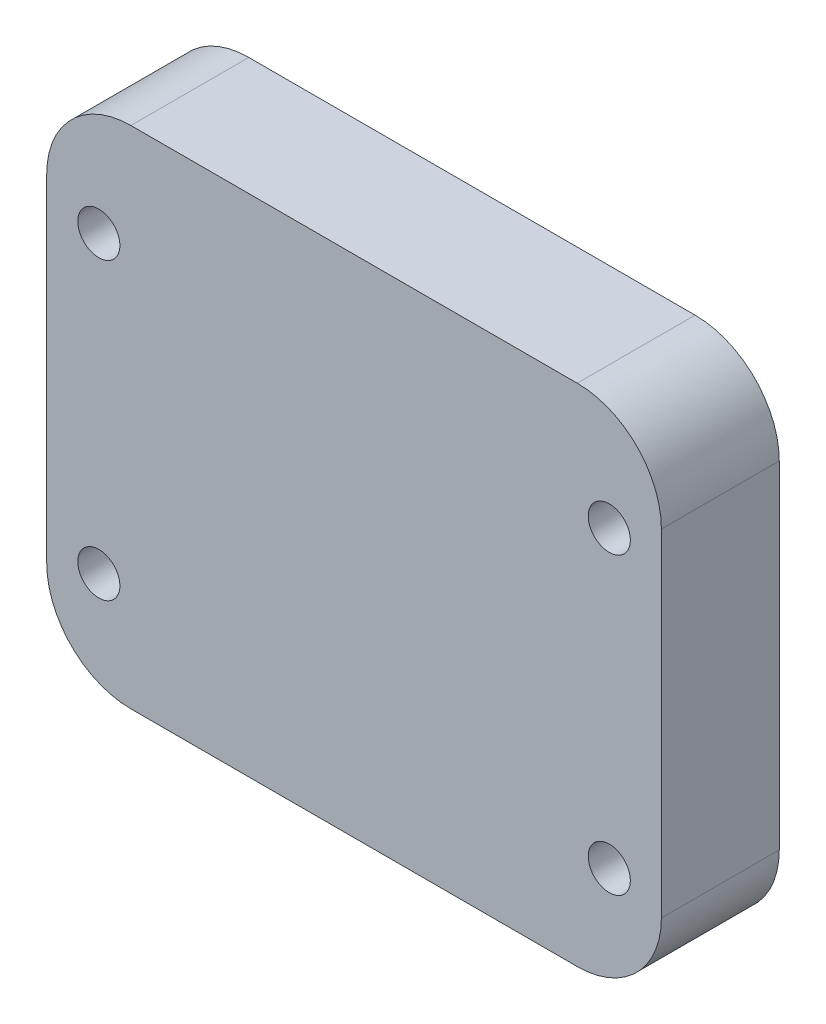
ISO-10303-21;
HEADER;
FILE_DESCRIPTION(('STEP AP214'),'2;1');
FILE_NAME('part.step','',(''),(''),'','','');
FILE_SCHEMA(('AUTOMOTIVE_DESIGN { 1 0 10303 214 1 1 1 1 }'));
ENDSEC;
DATA;
#1=APPLICATION_CONTEXT('core data for automotive mechanical design processes');
#2=APPLICATION_PROTOCOL_DEFINITION('international standard','automotive_design',2000,#1);
#3=PRODUCT_CONTEXT('',#1,'mechanical');
#4=PRODUCT('Part','Part','',(#3));
#5=PRODUCT_RELATED_PRODUCT_CATEGORY('part','',(#4));
#6=PRODUCT_DEFINITION_FORMATION('','',#4);
#7=PRODUCT_DEFINITION_CONTEXT('part definition',#1,'design');
#8=PRODUCT_DEFINITION('design','',#6,#7);
#9=PRODUCT_DEFINITION_SHAPE('','',#8);
#10=(LENGTH_UNIT() NAMED_UNIT(*) SI_UNIT(.MILLI.,.METRE.));
#11=(NAMED_UNIT(*) PLANE_ANGLE_UNIT() SI_UNIT($,.RADIAN.));
#12=(NAMED_UNIT(*) SI_UNIT($,.STERADIAN.) SOLID_ANGLE_UNIT());
#13=UNCERTAINTY_MEASURE_WITH_UNIT(LENGTH_MEASURE(1.E-05),#10,'distance_accuracy_value','');
#14=(GEOMETRIC_REPRESENTATION_CONTEXT(3) GLOBAL_UNCERTAINTY_ASSIGNED_CONTEXT((#13)) GLOBAL_UNIT_ASSIGNED_CONTEXT((#10,
#11,#12)) REPRESENTATION_CONTEXT('',''));
#15=CARTESIAN_POINT('',(0.,0.,0.));
#16=DIRECTION('',(0.,0.,1.));
#17=DIRECTION('',(1.,0.,0.));
#18=AXIS2_PLACEMENT_3D('',#15,#16,#17);
#19=CARTESIAN_POINT('',(-26.5,-20.,14.));
#20=DIRECTION('',(0.,0.,1.));
#21=DIRECTION('',(1.,0.,0.));
#22=AXIS2_PLACEMENT_3D('',#19,#20,#21);
#23=CYLINDRICAL_SURFACE('',#22,10.);
#24=DIRECTION('',(0.,0.,1.));
#25=VECTOR('',#24,1.);
#26=CARTESIAN_POINT('',(-36.5,-20.,14.));
#27=LINE('',#26,#25);
#28=CARTESIAN_POINT('',(-36.5,-20.,0.));
#29=VERTEX_POINT('',#28);
#30=CARTESIAN_POINT('',(-36.5,-20.,14.));
#31=VERTEX_POINT('',#30);
#32=EDGE_CURVE('E148',#29,#31,#27,.T.);
#33=ORIENTED_EDGE('',*,*,#32,.F.);
#34=CARTESIAN_POINT('',(-26.5,-20.,0.));
#35=DIRECTION('',(0.,0.,1.));
#36=DIRECTION('',(1.,0.,0.));
#37=AXIS2_PLACEMENT_3D('',#34,#35,#36);
#38=CIRCLE('',#37,10.);
#39=CARTESIAN_POINT('',(-26.5,-30.,0.));
#40=VERTEX_POINT('',#39);
#41=EDGE_CURVE('E40',#40,#29,#38,.F.);
#42=ORIENTED_EDGE('',*,*,#41,.F.);
#43=DIRECTION('',(0.,0.,1.));
#44=VECTOR('',#43,1.);
#45=CARTESIAN_POINT('',(-26.5,-30.,14.));
#46=LINE('',#45,#44);
#47=CARTESIAN_POINT('',(-26.5,-30.,14.));
#48=VERTEX_POINT('',#47);
#49=EDGE_CURVE('E100',#48,#40,#46,.F.);
#50=ORIENTED_EDGE('',*,*,#49,.F.);
#51=CARTESIAN_POINT('',(-26.5,-20.,14.));
#52=DIRECTION('',(0.,0.,1.));
#53=DIRECTION('',(1.,0.,0.));
#54=AXIS2_PLACEMENT_3D('',#51,#52,#53);
#55=CIRCLE('',#54,10.);
#56=EDGE_CURVE('E11',#31,#48,#55,.T.);
#57=ORIENTED_EDGE('',*,*,#56,.F.);
#58=EDGE_LOOP('',(#33,#42,#50,#57));
#59=FACE_BOUND('',#58,.T.);
#60=ADVANCED_FACE('F33',(#59),#23,.T.);
#61=CARTESIAN_POINT('',(-26.5,20.,14.));
#62=DIRECTION('',(0.,0.,1.));
#63=DIRECTION('',(1.,0.,0.));
#64=AXIS2_PLACEMENT_3D('',#61,#62,#63);
#65=CYLINDRICAL_SURFACE('',#64,10.);
#66=DIRECTION('',(0.,0.,1.));
#67=VECTOR('',#66,1.);
#68=CARTESIAN_POINT('',(-26.5,30.,14.));
#69=LINE('',#68,#67);
#70=CARTESIAN_POINT('',(-26.5,30.,0.));
#71=VERTEX_POINT('',#70);
#72=CARTESIAN_POINT('',(-26.5,30.,14.));
#73=VERTEX_POINT('',#72);
#74=EDGE_CURVE('E138',#71,#73,#69,.T.);
#75=ORIENTED_EDGE('',*,*,#74,.F.);
#76=CARTESIAN_POINT('',(-26.5,20.,0.));
#77=DIRECTION('',(0.,0.,1.));
#78=DIRECTION('',(1.,0.,0.));
#79=AXIS2_PLACEMENT_3D('',#76,#77,#78);
#80=CIRCLE('',#79,10.);
#81=CARTESIAN_POINT('',(-36.5,20.,0.));
#82=VERTEX_POINT('',#81);
#83=EDGE_CURVE('E144',#82,#71,#80,.F.);
#84=ORIENTED_EDGE('',*,*,#83,.F.);
#85=DIRECTION('',(0.,0.,1.));
#86=VECTOR('',#85,1.);
#87=CARTESIAN_POINT('',(-36.5,20.,14.));
#88=LINE('',#87,#86);
#89=CARTESIAN_POINT('',(-36.5,20.,14.));
#90=VERTEX_POINT('',#89);
#91=EDGE_CURVE('E141',#90,#82,#88,.F.);
#92=ORIENTED_EDGE('',*,*,#91,.F.);
#93=CARTESIAN_POINT('',(-26.5,20.,14.));
#94=DIRECTION('',(0.,0.,1.));
#95=DIRECTION('',(1.,0.,0.));
#96=AXIS2_PLACEMENT_3D('',#93,#94,#95);
#97=CIRCLE('',#96,10.);
#98=EDGE_CURVE('E146',#73,#90,#97,.T.);
#99=ORIENTED_EDGE('',*,*,#98,.F.);
#100=EDGE_LOOP('',(#75,#84,#92,#99));
#101=FACE_BOUND('',#100,.T.);
#102=ADVANCED_FACE('F206',(#101),#65,.T.);
#103=CARTESIAN_POINT('',(26.5,20.,14.));
#104=DIRECTION('',(0.,0.,1.));
#105=DIRECTION('',(1.,0.,0.));
#106=AXIS2_PLACEMENT_3D('',#103,#104,#105);
#107=CYLINDRICAL_SURFACE('',#106,10.);
#108=DIRECTION('',(0.,0.,1.));
#109=VECTOR('',#108,1.);
#110=CARTESIAN_POINT('',(36.5,20.,14.));
#111=LINE('',#110,#109);
#112=CARTESIAN_POINT('',(36.5,20.,0.));
#113=VERTEX_POINT('',#112);
#114=CARTESIAN_POINT('',(36.5,20.,14.));
#115=VERTEX_POINT('',#114);
#116=EDGE_CURVE('E128',#113,#115,#111,.T.);
#117=ORIENTED_EDGE('',*,*,#116,.F.);
#118=CARTESIAN_POINT('',(26.5,20.,0.));
#119=DIRECTION('',(0.,0.,1.));
#120=DIRECTION('',(1.,0.,0.));
#121=AXIS2_PLACEMENT_3D('',#118,#119,#120);
#122=CIRCLE('',#121,10.);
#123=CARTESIAN_POINT('',(26.5,30.,0.));
#124=VERTEX_POINT('',#123);
#125=EDGE_CURVE('E134',#124,#113,#122,.F.);
#126=ORIENTED_EDGE('',*,*,#125,.F.);
#127=DIRECTION('',(0.,0.,1.));
#128=VECTOR('',#127,1.);
#129=CARTESIAN_POINT('',(26.5,30.,14.));
#130=LINE('',#129,#128);
#131=CARTESIAN_POINT('',(26.5,30.,14.));
#132=VERTEX_POINT('',#131);
#133=EDGE_CURVE('E131',#132,#124,#130,.F.);
#134=ORIENTED_EDGE('',*,*,#133,.F.);
#135=CARTESIAN_POINT('',(26.5,20.,14.));
#136=DIRECTION('',(0.,0.,1.));
#137=DIRECTION('',(1.,0.,0.));
#138=AXIS2_PLACEMENT_3D('',#135,#136,#137);
#139=CIRCLE('',#138,10.);
#140=EDGE_CURVE('E136',#115,#132,#139,.T.);
#141=ORIENTED_EDGE('',*,*,#140,.F.);
#142=EDGE_LOOP('',(#117,#126,#134,#141));
#143=FACE_BOUND('',#142,.T.);
#144=ADVANCED_FACE('F199',(#143),#107,.T.);
#145=CARTESIAN_POINT('',(26.5,-20.,14.));
#146=DIRECTION('',(0.,0.,1.));
#147=DIRECTION('',(1.,0.,0.));
#148=AXIS2_PLACEMENT_3D('',#145,#146,#147);
#149=CYLINDRICAL_SURFACE('',#148,10.);
#150=DIRECTION('',(0.,0.,1.));
#151=VECTOR('',#150,1.);
#152=CARTESIAN_POINT('',(26.5,-30.,14.));
#153=LINE('',#152,#151);
#154=CARTESIAN_POINT('',(26.5,-30.,0.));
#155=VERTEX_POINT('',#154);
#156=CARTESIAN_POINT('',(26.5,-30.,14.));
#157=VERTEX_POINT('',#156);
#158=EDGE_CURVE('E99',#155,#157,#153,.T.);
#159=ORIENTED_EDGE('',*,*,#158,.F.);
#160=CARTESIAN_POINT('',(26.5,-20.,0.));
#161=DIRECTION('',(0.,0.,1.));
#162=DIRECTION('',(1.,0.,0.));
#163=AXIS2_PLACEMENT_3D('',#160,#161,#162);
#164=CIRCLE('',#163,10.);
#165=CARTESIAN_POINT('',(36.5,-20.,0.));
#166=VERTEX_POINT('',#165);
#167=EDGE_CURVE('E106',#166,#155,#164,.F.);
#168=ORIENTED_EDGE('',*,*,#167,.F.);
#169=DIRECTION('',(0.,0.,1.));
#170=VECTOR('',#169,1.);
#171=CARTESIAN_POINT('',(36.5,-20.,14.));
#172=LINE('',#171,#170);
#173=CARTESIAN_POINT('',(36.5,-20.,14.));
#174=VERTEX_POINT('',#173);
#175=EDGE_CURVE('E113',#174,#166,#172,.F.);
#176=ORIENTED_EDGE('',*,*,#175,.F.);
#177=CARTESIAN_POINT('',(26.5,-20.,14.));
#178=DIRECTION('',(0.,0.,1.));
#179=DIRECTION('',(1.,0.,0.));
#180=AXIS2_PLACEMENT_3D('',#177,#178,#179);
#181=CIRCLE('',#180,10.);
#182=EDGE_CURVE('E112',#157,#174,#181,.T.);
#183=ORIENTED_EDGE('',*,*,#182,.F.);
#184=EDGE_LOOP('',(#159,#168,#176,#183));
#185=FACE_BOUND('',#184,.T.);
#186=ADVANCED_FACE('F116',(#185),#149,.T.);
#187=CARTESIAN_POINT('',(-36.5,-30.,14.));
#188=DIRECTION('',(1.,0.,0.));
#189=DIRECTION('',(0.,0.,-1.));
#190=AXIS2_PLACEMENT_3D('',#187,#188,#189);
#191=PLANE('',#190);
#192=DIRECTION('',(0.,-1.,0.));
#193=VECTOR('',#192,1.);
#194=CARTESIAN_POINT('',(-36.5,-30.,0.));
#195=LINE('',#194,#193);
#196=EDGE_CURVE('E103',#82,#29,#195,.T.);
#197=ORIENTED_EDGE('',*,*,#196,.T.);
#198=ORIENTED_EDGE('',*,*,#32,.T.);
#199=DIRECTION('',(0.,-1.,0.));
#200=VECTOR('',#199,1.);
#201=CARTESIAN_POINT('',(-36.5,-30.,14.));
#202=LINE('',#201,#200);
#203=EDGE_CURVE('E167',#90,#31,#202,.T.);
#204=ORIENTED_EDGE('',*,*,#203,.F.);
#205=ORIENTED_EDGE('',*,*,#91,.T.);
#206=EDGE_LOOP('',(#197,#198,#204,#205));
#207=FACE_BOUND('',#206,.T.);
#208=ADVANCED_FACE('F155',(#207),#191,.F.);
#209=CARTESIAN_POINT('',(36.5,-30.,14.));
#210=DIRECTION('',(0.,1.,0.));
#211=DIRECTION('',(-1.,0.,0.));
#212=AXIS2_PLACEMENT_3D('',#209,#210,#211);
#213=PLANE('',#212);
#214=DIRECTION('',(1.,0.,0.));
#215=VECTOR('',#214,1.);
#216=CARTESIAN_POINT('',(36.5,-30.,14.));
#217=LINE('',#216,#215);
#218=EDGE_CURVE('E190',#48,#157,#217,.T.);
#219=ORIENTED_EDGE('',*,*,#218,.F.);
#220=ORIENTED_EDGE('',*,*,#49,.T.);
#221=DIRECTION('',(1.,0.,0.));
#222=VECTOR('',#221,1.);
#223=CARTESIAN_POINT('',(36.5,-30.,0.));
#224=LINE('',#223,#222);
#225=EDGE_CURVE('E94',#40,#155,#224,.T.);
#226=ORIENTED_EDGE('',*,*,#225,.T.);
#227=ORIENTED_EDGE('',*,*,#158,.T.);
#228=EDGE_LOOP('',(#219,#220,#226,#227));
#229=FACE_BOUND('',#228,.T.);
#230=ADVANCED_FACE('F97',(#229),#213,.F.);
#231=CARTESIAN_POINT('',(36.5,-30.,14.));
#232=DIRECTION('',(-1.,0.,0.));
#233=DIRECTION('',(0.,0.,1.));
#234=AXIS2_PLACEMENT_3D('',#231,#232,#233);
#235=PLANE('',#234);
#236=DIRECTION('',(0.,1.,0.));
#237=VECTOR('',#236,1.);
#238=CARTESIAN_POINT('',(36.5,-30.,0.));
#239=LINE('',#238,#237);
#240=EDGE_CURVE('E102',#166,#113,#239,.T.);
#241=ORIENTED_EDGE('',*,*,#240,.T.);
#242=ORIENTED_EDGE('',*,*,#116,.T.);
#243=DIRECTION('',(0.,1.,0.));
#244=VECTOR('',#243,1.);
#245=CARTESIAN_POINT('',(36.5,-30.,14.));
#246=LINE('',#245,#244);
#247=EDGE_CURVE('E121',#174,#115,#246,.T.);
#248=ORIENTED_EDGE('',*,*,#247,.F.);
#249=ORIENTED_EDGE('',*,*,#175,.T.);
#250=EDGE_LOOP('',(#241,#242,#248,#249));
#251=FACE_BOUND('',#250,.T.);
#252=ADVANCED_FACE('F196',(#251),#235,.F.);
#253=CARTESIAN_POINT('',(36.5,30.,14.));
#254=DIRECTION('',(0.,-1.,0.));
#255=DIRECTION('',(1.,0.,0.));
#256=AXIS2_PLACEMENT_3D('',#253,#254,#255);
#257=PLANE('',#256);
#258=DIRECTION('',(-1.,0.,0.));
#259=VECTOR('',#258,1.);
#260=CARTESIAN_POINT('',(36.5,30.,0.));
#261=LINE('',#260,#259);
#262=EDGE_CURVE('E165',#124,#71,#261,.T.);
#263=ORIENTED_EDGE('',*,*,#262,.T.);
#264=ORIENTED_EDGE('',*,*,#74,.T.);
#265=DIRECTION('',(-1.,0.,0.));
#266=VECTOR('',#265,1.);
#267=CARTESIAN_POINT('',(36.5,30.,14.));
#268=LINE('',#267,#266);
#269=EDGE_CURVE('E117',#132,#73,#268,.T.);
#270=ORIENTED_EDGE('',*,*,#269,.F.);
#271=ORIENTED_EDGE('',*,*,#133,.T.);
#272=EDGE_LOOP('',(#263,#264,#270,#271));
#273=FACE_BOUND('',#272,.T.);
#274=ADVANCED_FACE('F203',(#273),#257,.F.);
#275=CARTESIAN_POINT('',(0.,0.,14.));
#276=DIRECTION('',(0.,0.,1.));
#277=DIRECTION('',(1.,0.,0.));
#278=AXIS2_PLACEMENT_3D('',#275,#276,#277);
#279=PLANE('',#278);
#280=CARTESIAN_POINT('',(-30.310889135,-18.,14.));
#281=DIRECTION('',(0.,0.,1.));
#282=DIRECTION('',(1.,0.,0.));
#283=AXIS2_PLACEMENT_3D('',#280,#281,#282);
#284=CIRCLE('',#283,2.5);
#285=CARTESIAN_POINT('',(-27.810889135,-18.,14.));
#286=VERTEX_POINT('',#285);
#287=EDGE_CURVE('E184',#286,#286,#284,.T.);
#288=ORIENTED_EDGE('',*,*,#287,.F.);
#289=EDGE_LOOP('',(#288));
#290=FACE_BOUND('',#289,.T.);
#291=CARTESIAN_POINT('',(30.310889135,-18.,14.));
#292=DIRECTION('',(0.,0.,1.));
#293=DIRECTION('',(1.,0.,0.));
#294=AXIS2_PLACEMENT_3D('',#291,#292,#293);
#295=CIRCLE('',#294,2.50000000000001);
#296=CARTESIAN_POINT('',(32.810889135,-18.,14.));
#297=VERTEX_POINT('',#296);
#298=EDGE_CURVE('E174',#297,#297,#295,.T.);
#299=ORIENTED_EDGE('',*,*,#298,.F.);
#300=EDGE_LOOP('',(#299));
#301=FACE_BOUND('',#300,.T.);
#302=CARTESIAN_POINT('',(30.310889135,17.,14.));
#303=DIRECTION('',(0.,0.,1.));
#304=DIRECTION('',(1.,0.,0.));
#305=AXIS2_PLACEMENT_3D('',#302,#303,#304);
#306=CIRCLE('',#305,2.50000000000001);
#307=CARTESIAN_POINT('',(32.810889135,17.,14.));
#308=VERTEX_POINT('',#307);
#309=EDGE_CURVE('E171',#308,#308,#306,.T.);
#310=ORIENTED_EDGE('',*,*,#309,.F.);
#311=EDGE_LOOP('',(#310));
#312=FACE_BOUND('',#311,.T.);
#313=CARTESIAN_POINT('',(-30.310889135,17.,14.));
#314=DIRECTION('',(0.,0.,1.));
#315=DIRECTION('',(1.,0.,0.));
#316=AXIS2_PLACEMENT_3D('',#313,#314,#315);
#317=CIRCLE('',#316,2.5);
#318=CARTESIAN_POINT('',(-27.810889135,17.,14.));
#319=VERTEX_POINT('',#318);
#320=EDGE_CURVE('E160',#319,#319,#317,.T.);
#321=ORIENTED_EDGE('',*,*,#320,.F.);
#322=EDGE_LOOP('',(#321));
#323=FACE_BOUND('',#322,.T.);
#324=ORIENTED_EDGE('',*,*,#203,.T.);
#325=ORIENTED_EDGE('',*,*,#56,.T.);
#326=ORIENTED_EDGE('',*,*,#218,.T.);
#327=ORIENTED_EDGE('',*,*,#182,.T.);
#328=ORIENTED_EDGE('',*,*,#247,.T.);
#329=ORIENTED_EDGE('',*,*,#140,.T.);
#330=ORIENTED_EDGE('',*,*,#269,.T.);
#331=ORIENTED_EDGE('',*,*,#98,.T.);
#332=EDGE_LOOP('',(#324,#325,#326,#327,#328,#329,#330,#331));
#333=FACE_BOUND('',#332,.T.);
#334=ADVANCED_FACE('F193',(#290,#301,#312,#323,#333),#279,.T.);
#335=CARTESIAN_POINT('',(0.,0.,0.));
#336=DIRECTION('',(0.,0.,1.));
#337=DIRECTION('',(1.,0.,0.));
#338=AXIS2_PLACEMENT_3D('',#335,#336,#337);
#339=PLANE('',#338);
#340=CARTESIAN_POINT('',(-30.310889135,-18.,0.));
#341=DIRECTION('',(0.,0.,1.));
#342=DIRECTION('',(1.,0.,0.));
#343=AXIS2_PLACEMENT_3D('',#340,#341,#342);
#344=CIRCLE('',#343,2.5);
#345=CARTESIAN_POINT('',(-27.810889135,-18.,0.));
#346=VERTEX_POINT('',#345);
#347=EDGE_CURVE('E124',#346,#346,#344,.T.);
#348=ORIENTED_EDGE('',*,*,#347,.T.);
#349=EDGE_LOOP('',(#348));
#350=FACE_BOUND('',#349,.T.);
#351=CARTESIAN_POINT('',(30.310889135,-18.,0.));
#352=DIRECTION('',(0.,0.,1.));
#353=DIRECTION('',(1.,0.,0.));
#354=AXIS2_PLACEMENT_3D('',#351,#352,#353);
#355=CIRCLE('',#354,2.50000000000001);
#356=CARTESIAN_POINT('',(32.810889135,-18.,0.));
#357=VERTEX_POINT('',#356);
#358=EDGE_CURVE('E172',#357,#357,#355,.T.);
#359=ORIENTED_EDGE('',*,*,#358,.T.);
#360=EDGE_LOOP('',(#359));
#361=FACE_BOUND('',#360,.T.);
#362=CARTESIAN_POINT('',(30.310889135,17.,0.));
#363=DIRECTION('',(0.,0.,1.));
#364=DIRECTION('',(1.,0.,0.));
#365=AXIS2_PLACEMENT_3D('',#362,#363,#364);
#366=CIRCLE('',#365,2.50000000000001);
#367=CARTESIAN_POINT('',(32.810889135,17.,0.));
#368=VERTEX_POINT('',#367);
#369=EDGE_CURVE('E169',#368,#368,#366,.T.);
#370=ORIENTED_EDGE('',*,*,#369,.T.);
#371=EDGE_LOOP('',(#370));
#372=FACE_BOUND('',#371,.T.);
#373=CARTESIAN_POINT('',(-30.310889135,17.,0.));
#374=DIRECTION('',(0.,0.,1.));
#375=DIRECTION('',(1.,0.,0.));
#376=AXIS2_PLACEMENT_3D('',#373,#374,#375);
#377=CIRCLE('',#376,2.5);
#378=CARTESIAN_POINT('',(-27.810889135,17.,0.));
#379=VERTEX_POINT('',#378);
#380=EDGE_CURVE('E157',#379,#379,#377,.T.);
#381=ORIENTED_EDGE('',*,*,#380,.T.);
#382=EDGE_LOOP('',(#381));
#383=FACE_BOUND('',#382,.T.);
#384=ORIENTED_EDGE('',*,*,#225,.F.);
#385=ORIENTED_EDGE('',*,*,#41,.T.);
#386=ORIENTED_EDGE('',*,*,#196,.F.);
#387=ORIENTED_EDGE('',*,*,#83,.T.);
#388=ORIENTED_EDGE('',*,*,#262,.F.);
#389=ORIENTED_EDGE('',*,*,#125,.T.);
#390=ORIENTED_EDGE('',*,*,#240,.F.);
#391=ORIENTED_EDGE('',*,*,#167,.T.);
#392=EDGE_LOOP('',(#384,#385,#386,#387,#388,#389,#390,#391));
#393=FACE_BOUND('',#392,.T.);
#394=ADVANCED_FACE('F107',(#350,#361,#372,#383,#393),#339,.F.);
#395=CARTESIAN_POINT('',(-30.310889135,17.,-2.));
#396=DIRECTION('',(0.,0.,1.));
#397=DIRECTION('',(1.,0.,0.));
#398=AXIS2_PLACEMENT_3D('',#395,#396,#397);
#399=CYLINDRICAL_SURFACE('',#398,2.5);
#400=ORIENTED_EDGE('',*,*,#320,.T.);
#401=EDGE_LOOP('',(#400));
#402=FACE_BOUND('',#401,.T.);
#403=ORIENTED_EDGE('',*,*,#380,.F.);
#404=EDGE_LOOP('',(#403));
#405=FACE_BOUND('',#404,.T.);
#406=ADVANCED_FACE('F226',(#402,#405),#399,.F.);
#407=CARTESIAN_POINT('',(30.310889135,17.,-2.));
#408=DIRECTION('',(0.,0.,1.));
#409=DIRECTION('',(1.,0.,0.));
#410=AXIS2_PLACEMENT_3D('',#407,#408,#409);
#411=CYLINDRICAL_SURFACE('',#410,2.50000000000001);
#412=ORIENTED_EDGE('',*,*,#309,.T.);
#413=EDGE_LOOP('',(#412));
#414=FACE_BOUND('',#413,.T.);
#415=ORIENTED_EDGE('',*,*,#369,.F.);
#416=EDGE_LOOP('',(#415));
#417=FACE_BOUND('',#416,.T.);
#418=ADVANCED_FACE('F233',(#414,#417),#411,.F.);
#419=CARTESIAN_POINT('',(30.310889135,-18.,-2.));
#420=DIRECTION('',(0.,0.,1.));
#421=DIRECTION('',(1.,0.,0.));
#422=AXIS2_PLACEMENT_3D('',#419,#420,#421);
#423=CYLINDRICAL_SURFACE('',#422,2.50000000000001);
#424=ORIENTED_EDGE('',*,*,#298,.T.);
#425=EDGE_LOOP('',(#424));
#426=FACE_BOUND('',#425,.T.);
#427=ORIENTED_EDGE('',*,*,#358,.F.);
#428=EDGE_LOOP('',(#427));
#429=FACE_BOUND('',#428,.T.);
#430=ADVANCED_FACE('F237',(#426,#429),#423,.F.);
#431=CARTESIAN_POINT('',(-30.310889135,-18.,-2.));
#432=DIRECTION('',(0.,0.,1.));
#433=DIRECTION('',(1.,0.,0.));
#434=AXIS2_PLACEMENT_3D('',#431,#432,#433);
#435=CYLINDRICAL_SURFACE('',#434,2.5);
#436=ORIENTED_EDGE('',*,*,#287,.T.);
#437=EDGE_LOOP('',(#436));
#438=FACE_BOUND('',#437,.T.);
#439=ORIENTED_EDGE('',*,*,#347,.F.);
#440=EDGE_LOOP('',(#439));
#441=FACE_BOUND('',#440,.T.);
#442=ADVANCED_FACE('F241',(#438,#441),#435,.F.);
#443=CLOSED_SHELL('',(#60,#102,#144,#186,#208,#230,#252,#274,#334,#394,#406,#418,#430,#442));
#444=MANIFOLD_SOLID_BREP('B2',#443);
#445=ADVANCED_BREP_SHAPE_REPRESENTATION('',(#18,#444),#14);
#446=SHAPE_DEFINITION_REPRESENTATION(#9,#445);
ENDSEC;
END-ISO-10303-21;
